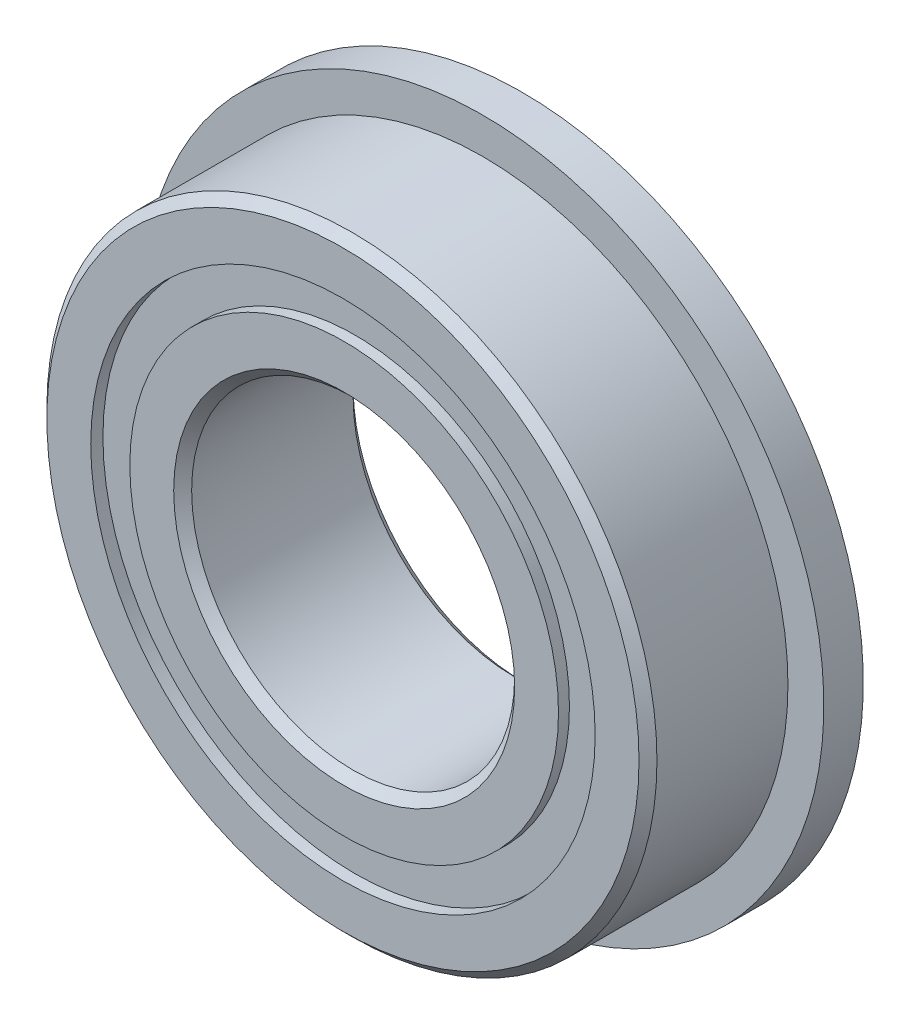
ISO-10303-21;
HEADER;
FILE_DESCRIPTION(('STEP AP214'),'2;1');
FILE_NAME('part.step','',(''),(''),'','','');
FILE_SCHEMA(('AUTOMOTIVE_DESIGN { 1 0 10303 214 1 1 1 1 }'));
ENDSEC;
DATA;
#1=APPLICATION_CONTEXT('core data for automotive mechanical design processes');
#2=APPLICATION_PROTOCOL_DEFINITION('international standard','automotive_design',2000,#1);
#3=PRODUCT_CONTEXT('',#1,'mechanical');
#4=PRODUCT('Part','Part','',(#3));
#5=PRODUCT_RELATED_PRODUCT_CATEGORY('part','',(#4));
#6=PRODUCT_DEFINITION_FORMATION('','',#4);
#7=PRODUCT_DEFINITION_CONTEXT('part definition',#1,'design');
#8=PRODUCT_DEFINITION('design','',#6,#7);
#9=PRODUCT_DEFINITION_SHAPE('','',#8);
#10=(LENGTH_UNIT() NAMED_UNIT(*) SI_UNIT(.MILLI.,.METRE.));
#11=(NAMED_UNIT(*) PLANE_ANGLE_UNIT() SI_UNIT($,.RADIAN.));
#12=(NAMED_UNIT(*) SI_UNIT($,.STERADIAN.) SOLID_ANGLE_UNIT());
#13=UNCERTAINTY_MEASURE_WITH_UNIT(LENGTH_MEASURE(1.E-05),#10,'distance_accuracy_value','');
#14=(GEOMETRIC_REPRESENTATION_CONTEXT(3) GLOBAL_UNCERTAINTY_ASSIGNED_CONTEXT((#13)) GLOBAL_UNIT_ASSIGNED_CONTEXT((#10,
#11,#12)) REPRESENTATION_CONTEXT('',''));
#15=CARTESIAN_POINT('',(0.,0.,0.));
#16=DIRECTION('',(0.,0.,1.));
#17=DIRECTION('',(1.,0.,0.));
#18=AXIS2_PLACEMENT_3D('',#15,#16,#17);
#19=CARTESIAN_POINT('',(0.,0.,2.53780535874026));
#20=DIRECTION('',(0.,0.,-1.));
#21=DIRECTION('',(-1.,0.,0.));
#22=AXIS2_PLACEMENT_3D('',#19,#20,#21);
#23=CONICAL_SURFACE('',#22,9.44444444444445,0.785398163397447);
#24=CARTESIAN_POINT('',(0.,0.,2.81558313651804));
#25=DIRECTION('',(0.,0.,1.));
#26=DIRECTION('',(1.,0.,0.));
#27=AXIS2_PLACEMENT_3D('',#24,#25,#26);
#28=CIRCLE('',#27,9.16666666666667);
#29=CARTESIAN_POINT('',(9.16666666666667,0.,2.81558313651804));
#30=VERTEX_POINT('',#29);
#31=EDGE_CURVE('E76',#30,#30,#28,.T.);
#32=ORIENTED_EDGE('',*,*,#31,.F.);
#33=EDGE_LOOP('',(#32));
#34=FACE_BOUND('',#33,.T.);
#35=CARTESIAN_POINT('',(0.,0.,2.53780535874026));
#36=DIRECTION('',(0.,0.,1.));
#37=DIRECTION('',(1.,0.,0.));
#38=AXIS2_PLACEMENT_3D('',#35,#36,#37);
#39=CIRCLE('',#38,9.44444444444445);
#40=CARTESIAN_POINT('',(9.44444444444445,0.,2.53780535874026));
#41=VERTEX_POINT('',#40);
#42=EDGE_CURVE('E11',#41,#41,#39,.T.);
#43=ORIENTED_EDGE('',*,*,#42,.T.);
#44=EDGE_LOOP('',(#43));
#45=FACE_BOUND('',#44,.T.);
#46=ADVANCED_FACE('F47',(#34,#45),#23,.T.);
#47=CARTESIAN_POINT('',(0.,0.,2.81558313651804));
#48=DIRECTION('',(0.,0.,1.));
#49=DIRECTION('',(1.,0.,0.));
#50=AXIS2_PLACEMENT_3D('',#47,#48,#49);
#51=CYLINDRICAL_SURFACE('',#50,9.44444444444445);
#52=CARTESIAN_POINT('',(0.,0.,-1.5177501968153));
#53=DIRECTION('',(0.,0.,1.));
#54=DIRECTION('',(1.,0.,0.));
#55=AXIS2_PLACEMENT_3D('',#52,#53,#54);
#56=CIRCLE('',#55,9.44444444444445);
#57=CARTESIAN_POINT('',(9.44444444444445,0.,-1.5177501968153));
#58=VERTEX_POINT('',#57);
#59=EDGE_CURVE('E79',#58,#58,#56,.T.);
#60=ORIENTED_EDGE('',*,*,#59,.T.);
#61=EDGE_LOOP('',(#60));
#62=FACE_BOUND('',#61,.T.);
#63=ORIENTED_EDGE('',*,*,#42,.F.);
#64=EDGE_LOOP('',(#63));
#65=FACE_BOUND('',#64,.T.);
#66=ADVANCED_FACE('F101',(#62,#65),#51,.T.);
#67=CARTESIAN_POINT('',(0.,9.16666666666667,-2.73997241903752));
#68=DIRECTION('',(0.,0.,1.));
#69=DIRECTION('',(1.,0.,0.));
#70=AXIS2_PLACEMENT_3D('',#67,#68,#69);
#71=PLANE('',#70);
#72=CARTESIAN_POINT('',(0.,0.,-2.73997241903752));
#73=DIRECTION('',(0.,0.,1.));
#74=DIRECTION('',(1.,0.,0.));
#75=AXIS2_PLACEMENT_3D('',#72,#73,#74);
#76=CIRCLE('',#75,7.80830280830281);
#77=CARTESIAN_POINT('',(7.80830280830281,0.,-2.73997241903752));
#78=VERTEX_POINT('',#77);
#79=EDGE_CURVE('E54',#78,#78,#76,.T.);
#80=ORIENTED_EDGE('',*,*,#79,.T.);
#81=EDGE_LOOP('',(#80));
#82=FACE_BOUND('',#81,.T.);
#83=CARTESIAN_POINT('',(0.,0.,-2.73997241903752));
#84=DIRECTION('',(0.,0.,-1.));
#85=DIRECTION('',(-1.,0.,0.));
#86=AXIS2_PLACEMENT_3D('',#83,#84,#85);
#87=CIRCLE('',#86,10.5555555555556);
#88=CARTESIAN_POINT('',(-10.5555555555556,0.,-2.73997241903752));
#89=VERTEX_POINT('',#88);
#90=EDGE_CURVE('E82',#89,#89,#87,.T.);
#91=ORIENTED_EDGE('',*,*,#90,.T.);
#92=EDGE_LOOP('',(#91));
#93=FACE_BOUND('',#92,.T.);
#94=ADVANCED_FACE('F104',(#82,#93),#71,.F.);
#95=CARTESIAN_POINT('',(0.,0.,2.81558313651804));
#96=DIRECTION('',(0.,0.,1.));
#97=DIRECTION('',(1.,0.,0.));
#98=AXIS2_PLACEMENT_3D('',#95,#96,#97);
#99=CYLINDRICAL_SURFACE('',#98,7.80830280830281);
#100=CARTESIAN_POINT('',(0.,0.,-1.19676254249431));
#101=DIRECTION('',(0.,0.,1.));
#102=DIRECTION('',(1.,0.,0.));
#103=AXIS2_PLACEMENT_3D('',#100,#101,#102);
#104=CIRCLE('',#103,7.80830280830281);
#105=CARTESIAN_POINT('',(7.80830280830281,0.,-1.19676254249431));
#106=VERTEX_POINT('',#105);
#107=EDGE_CURVE('E60',#106,#106,#104,.T.);
#108=ORIENTED_EDGE('',*,*,#107,.T.);
#109=EDGE_LOOP('',(#108));
#110=FACE_BOUND('',#109,.T.);
#111=ORIENTED_EDGE('',*,*,#79,.F.);
#112=EDGE_LOOP('',(#111));
#113=FACE_BOUND('',#112,.T.);
#114=ADVANCED_FACE('F109',(#110,#113),#99,.F.);
#115=CARTESIAN_POINT('',(0.,0.,0.0378053587402572));
#116=DIRECTION('',(0.,0.,1.));
#117=DIRECTION('',(1.,0.,0.));
#118=AXIS2_PLACEMENT_3D('',#115,#116,#117);
#119=TOROIDAL_SURFACE('',#118,7.22222222222222,1.36661931646647);
#120=ORIENTED_EDGE('',*,*,#107,.F.);
#121=EDGE_LOOP('',(#120));
#122=FACE_BOUND('',#121,.T.);
#123=CARTESIAN_POINT('',(0.,0.,1.27237325997483));
#124=DIRECTION('',(0.,0.,1.));
#125=DIRECTION('',(1.,0.,0.));
#126=AXIS2_PLACEMENT_3D('',#123,#124,#125);
#127=CIRCLE('',#126,7.80830280830281);
#128=CARTESIAN_POINT('',(7.80830280830281,0.,1.27237325997483));
#129=VERTEX_POINT('',#128);
#130=EDGE_CURVE('E66',#129,#129,#127,.T.);
#131=ORIENTED_EDGE('',*,*,#130,.T.);
#132=EDGE_LOOP('',(#131));
#133=FACE_BOUND('',#132,.T.);
#134=ADVANCED_FACE('F115',(#122,#133),#119,.F.);
#135=CARTESIAN_POINT('',(0.,0.,2.81558313651804));
#136=DIRECTION('',(0.,0.,1.));
#137=DIRECTION('',(1.,0.,0.));
#138=AXIS2_PLACEMENT_3D('',#135,#136,#137);
#139=CYLINDRICAL_SURFACE('',#138,7.80830280830281);
#140=ORIENTED_EDGE('',*,*,#130,.F.);
#141=EDGE_LOOP('',(#140));
#142=FACE_BOUND('',#141,.T.);
#143=CARTESIAN_POINT('',(0.,0.,2.81558313651804));
#144=DIRECTION('',(0.,0.,1.));
#145=DIRECTION('',(1.,0.,0.));
#146=AXIS2_PLACEMENT_3D('',#143,#144,#145);
#147=CIRCLE('',#146,7.80830280830281);
#148=CARTESIAN_POINT('',(7.80830280830281,0.,2.81558313651804));
#149=VERTEX_POINT('',#148);
#150=EDGE_CURVE('E72',#149,#149,#147,.T.);
#151=ORIENTED_EDGE('',*,*,#150,.T.);
#152=EDGE_LOOP('',(#151));
#153=FACE_BOUND('',#152,.T.);
#154=ADVANCED_FACE('F119',(#142,#153),#139,.F.);
#155=CARTESIAN_POINT('',(0.,9.16666666666667,2.81558313651804));
#156=DIRECTION('',(0.,0.,-1.));
#157=DIRECTION('',(-1.,0.,0.));
#158=AXIS2_PLACEMENT_3D('',#155,#156,#157);
#159=PLANE('',#158);
#160=ORIENTED_EDGE('',*,*,#150,.F.);
#161=EDGE_LOOP('',(#160));
#162=FACE_BOUND('',#161,.T.);
#163=ORIENTED_EDGE('',*,*,#31,.T.);
#164=EDGE_LOOP('',(#163));
#165=FACE_BOUND('',#164,.T.);
#166=ADVANCED_FACE('F97',(#162,#165),#159,.F.);
#167=CARTESIAN_POINT('',(0.,7.80830280830281,-1.5177501968153));
#168=DIRECTION('',(0.,0.,1.));
#169=DIRECTION('',(1.,0.,0.));
#170=AXIS2_PLACEMENT_3D('',#167,#168,#169);
#171=PLANE('',#170);
#172=CARTESIAN_POINT('',(0.,0.,-1.5177501968153));
#173=DIRECTION('',(0.,0.,-1.));
#174=DIRECTION('',(-1.,0.,0.));
#175=AXIS2_PLACEMENT_3D('',#172,#173,#174);
#176=CIRCLE('',#175,10.5555555555556);
#177=CARTESIAN_POINT('',(-10.5555555555556,0.,-1.5177501968153));
#178=VERTEX_POINT('',#177);
#179=EDGE_CURVE('E86',#178,#178,#176,.T.);
#180=ORIENTED_EDGE('',*,*,#179,.F.);
#181=EDGE_LOOP('',(#180));
#182=FACE_BOUND('',#181,.T.);
#183=ORIENTED_EDGE('',*,*,#59,.F.);
#184=EDGE_LOOP('',(#183));
#185=FACE_BOUND('',#184,.T.);
#186=ADVANCED_FACE('F94',(#182,#185),#171,.T.);
#187=CARTESIAN_POINT('',(0.,0.,-2.73997241903752));
#188=DIRECTION('',(0.,0.,-1.));
#189=DIRECTION('',(-1.,0.,0.));
#190=AXIS2_PLACEMENT_3D('',#187,#188,#189);
#191=CYLINDRICAL_SURFACE('',#190,10.5555555555556);
#192=ORIENTED_EDGE('',*,*,#179,.T.);
#193=EDGE_LOOP('',(#192));
#194=FACE_BOUND('',#193,.T.);
#195=ORIENTED_EDGE('',*,*,#90,.F.);
#196=EDGE_LOOP('',(#195));
#197=FACE_BOUND('',#196,.T.);
#198=ADVANCED_FACE('F91',(#194,#197),#191,.T.);
#199=CLOSED_SHELL('',(#46,#66,#94,#114,#134,#154,#166,#186,#198));
#200=MANIFOLD_SOLID_BREP('B2',#199);
#201=CARTESIAN_POINT('',(0.,6.63614163614164,2.77777777777778));
#202=DIRECTION('',(0.,0.,-1.));
#203=DIRECTION('',(-1.,0.,0.));
#204=AXIS2_PLACEMENT_3D('',#201,#202,#203);
#205=PLANE('',#204);
#206=CARTESIAN_POINT('',(0.,0.,2.77777777777778));
#207=DIRECTION('',(0.,0.,1.));
#208=DIRECTION('',(1.,0.,0.));
#209=AXIS2_PLACEMENT_3D('',#206,#207,#208);
#210=CIRCLE('',#209,5.27777777777778);
#211=CARTESIAN_POINT('',(5.27777777777778,0.,2.77777777777778));
#212=VERTEX_POINT('',#211);
#213=EDGE_CURVE('E247',#212,#212,#210,.T.);
#214=ORIENTED_EDGE('',*,*,#213,.F.);
#215=EDGE_LOOP('',(#214));
#216=FACE_BOUND('',#215,.T.);
#217=CARTESIAN_POINT('',(0.,0.,2.77777777777778));
#218=DIRECTION('',(0.,0.,1.));
#219=DIRECTION('',(1.,0.,0.));
#220=AXIS2_PLACEMENT_3D('',#217,#218,#219);
#221=CIRCLE('',#220,6.63614163614164);
#222=CARTESIAN_POINT('',(6.63614163614164,0.,2.77777777777778));
#223=VERTEX_POINT('',#222);
#224=EDGE_CURVE('E46',#223,#223,#221,.T.);
#225=ORIENTED_EDGE('',*,*,#224,.T.);
#226=EDGE_LOOP('',(#225));
#227=FACE_BOUND('',#226,.T.);
#228=ADVANCED_FACE('F211',(#216,#227),#205,.F.);
#229=CARTESIAN_POINT('',(0.,0.,2.77777777777778));
#230=DIRECTION('',(0.,0.,1.));
#231=DIRECTION('',(1.,0.,0.));
#232=AXIS2_PLACEMENT_3D('',#229,#230,#231);
#233=CYLINDRICAL_SURFACE('',#232,6.63614163614164);
#234=ORIENTED_EDGE('',*,*,#224,.F.);
#235=EDGE_LOOP('',(#234));
#236=FACE_BOUND('',#235,.T.);
#237=CARTESIAN_POINT('',(0.,0.,1.23456790123457));
#238=DIRECTION('',(0.,0.,1.));
#239=DIRECTION('',(1.,0.,0.));
#240=AXIS2_PLACEMENT_3D('',#237,#238,#239);
#241=CIRCLE('',#240,6.63614163614164);
#242=CARTESIAN_POINT('',(6.63614163614164,0.,1.23456790123457));
#243=VERTEX_POINT('',#242);
#244=EDGE_CURVE('E218',#243,#243,#241,.T.);
#245=ORIENTED_EDGE('',*,*,#244,.T.);
#246=EDGE_LOOP('',(#245));
#247=FACE_BOUND('',#246,.T.);
#248=ADVANCED_FACE('F254',(#236,#247),#233,.T.);
#249=CARTESIAN_POINT('',(0.,0.,0.));
#250=DIRECTION('',(0.,0.,1.));
#251=DIRECTION('',(1.,0.,0.));
#252=AXIS2_PLACEMENT_3D('',#249,#250,#251);
#253=TOROIDAL_SURFACE('',#252,7.22222222222222,1.36661931646647);
#254=ORIENTED_EDGE('',*,*,#244,.F.);
#255=EDGE_LOOP('',(#254));
#256=FACE_BOUND('',#255,.T.);
#257=CARTESIAN_POINT('',(0.,0.,-1.23456790123457));
#258=DIRECTION('',(0.,0.,1.));
#259=DIRECTION('',(1.,0.,0.));
#260=AXIS2_PLACEMENT_3D('',#257,#258,#259);
#261=CIRCLE('',#260,6.63614163614164);
#262=CARTESIAN_POINT('',(6.63614163614164,0.,-1.23456790123457));
#263=VERTEX_POINT('',#262);
#264=EDGE_CURVE('E225',#263,#263,#261,.T.);
#265=ORIENTED_EDGE('',*,*,#264,.T.);
#266=EDGE_LOOP('',(#265));
#267=FACE_BOUND('',#266,.T.);
#268=ADVANCED_FACE('F258',(#256,#267),#253,.F.);
#269=CARTESIAN_POINT('',(0.,0.,2.77777777777778));
#270=DIRECTION('',(0.,0.,1.));
#271=DIRECTION('',(1.,0.,0.));
#272=AXIS2_PLACEMENT_3D('',#269,#270,#271);
#273=CYLINDRICAL_SURFACE('',#272,6.63614163614164);
#274=ORIENTED_EDGE('',*,*,#264,.F.);
#275=EDGE_LOOP('',(#274));
#276=FACE_BOUND('',#275,.T.);
#277=CARTESIAN_POINT('',(0.,0.,-2.77777777777778));
#278=DIRECTION('',(0.,0.,1.));
#279=DIRECTION('',(1.,0.,0.));
#280=AXIS2_PLACEMENT_3D('',#277,#278,#279);
#281=CIRCLE('',#280,6.63614163614164);
#282=CARTESIAN_POINT('',(6.63614163614164,0.,-2.77777777777778));
#283=VERTEX_POINT('',#282);
#284=EDGE_CURVE('E230',#283,#283,#281,.T.);
#285=ORIENTED_EDGE('',*,*,#284,.T.);
#286=EDGE_LOOP('',(#285));
#287=FACE_BOUND('',#286,.T.);
#288=ADVANCED_FACE('F263',(#276,#287),#273,.T.);
#289=CARTESIAN_POINT('',(0.,5.27777777777778,-2.77777777777778));
#290=DIRECTION('',(0.,0.,1.));
#291=DIRECTION('',(1.,0.,0.));
#292=AXIS2_PLACEMENT_3D('',#289,#290,#291);
#293=PLANE('',#292);
#294=ORIENTED_EDGE('',*,*,#284,.F.);
#295=EDGE_LOOP('',(#294));
#296=FACE_BOUND('',#295,.T.);
#297=CARTESIAN_POINT('',(0.,0.,-2.77777777777778));
#298=DIRECTION('',(0.,0.,1.));
#299=DIRECTION('',(1.,0.,0.));
#300=AXIS2_PLACEMENT_3D('',#297,#298,#299);
#301=CIRCLE('',#300,5.27777777777778);
#302=CARTESIAN_POINT('',(5.27777777777778,0.,-2.77777777777778));
#303=VERTEX_POINT('',#302);
#304=EDGE_CURVE('E236',#303,#303,#301,.T.);
#305=ORIENTED_EDGE('',*,*,#304,.T.);
#306=EDGE_LOOP('',(#305));
#307=FACE_BOUND('',#306,.T.);
#308=ADVANCED_FACE('F269',(#296,#307),#293,.F.);
#309=CARTESIAN_POINT('',(0.,0.,-2.5));
#310=DIRECTION('',(0.,0.,-1.));
#311=DIRECTION('',(-1.,0.,0.));
#312=AXIS2_PLACEMENT_3D('',#309,#310,#311);
#313=CONICAL_SURFACE('',#312,5.,0.785398163397445);
#314=ORIENTED_EDGE('',*,*,#304,.F.);
#315=EDGE_LOOP('',(#314));
#316=FACE_BOUND('',#315,.T.);
#317=CARTESIAN_POINT('',(0.,0.,-2.5));
#318=DIRECTION('',(0.,0.,1.));
#319=DIRECTION('',(1.,0.,0.));
#320=AXIS2_PLACEMENT_3D('',#317,#318,#319);
#321=CIRCLE('',#320,5.);
#322=CARTESIAN_POINT('',(5.,0.,-2.5));
#323=VERTEX_POINT('',#322);
#324=EDGE_CURVE('E240',#323,#323,#321,.T.);
#325=ORIENTED_EDGE('',*,*,#324,.T.);
#326=EDGE_LOOP('',(#325));
#327=FACE_BOUND('',#326,.T.);
#328=ADVANCED_FACE('F273',(#316,#327),#313,.F.);
#329=CARTESIAN_POINT('',(0.,0.,2.77777777777778));
#330=DIRECTION('',(0.,0.,1.));
#331=DIRECTION('',(1.,0.,0.));
#332=AXIS2_PLACEMENT_3D('',#329,#330,#331);
#333=CYLINDRICAL_SURFACE('',#332,5.);
#334=ORIENTED_EDGE('',*,*,#324,.F.);
#335=EDGE_LOOP('',(#334));
#336=FACE_BOUND('',#335,.T.);
#337=CARTESIAN_POINT('',(0.,0.,2.5));
#338=DIRECTION('',(0.,0.,1.));
#339=DIRECTION('',(1.,0.,0.));
#340=AXIS2_PLACEMENT_3D('',#337,#338,#339);
#341=CIRCLE('',#340,5.);
#342=CARTESIAN_POINT('',(5.,0.,2.5));
#343=VERTEX_POINT('',#342);
#344=EDGE_CURVE('E243',#343,#343,#341,.T.);
#345=ORIENTED_EDGE('',*,*,#344,.T.);
#346=EDGE_LOOP('',(#345));
#347=FACE_BOUND('',#346,.T.);
#348=ADVANCED_FACE('F277',(#336,#347),#333,.F.);
#349=CARTESIAN_POINT('',(0.,0.,2.77777777777778));
#350=DIRECTION('',(0.,0.,1.));
#351=DIRECTION('',(1.,0.,0.));
#352=AXIS2_PLACEMENT_3D('',#349,#350,#351);
#353=CONICAL_SURFACE('',#352,5.27777777777778,0.78539816339745);
#354=ORIENTED_EDGE('',*,*,#344,.F.);
#355=EDGE_LOOP('',(#354));
#356=FACE_BOUND('',#355,.T.);
#357=ORIENTED_EDGE('',*,*,#213,.T.);
#358=EDGE_LOOP('',(#357));
#359=FACE_BOUND('',#358,.T.);
#360=ADVANCED_FACE('F251',(#356,#359),#353,.F.);
#361=CLOSED_SHELL('',(#228,#248,#268,#288,#308,#328,#348,#360));
#362=MANIFOLD_SOLID_BREP('B6',#361);
#363=CARTESIAN_POINT('',(0.,7.80830280830281,2.43861347862112));
#364=DIRECTION('',(0.,0.,-1.));
#365=DIRECTION('',(-1.,0.,0.));
#366=AXIS2_PLACEMENT_3D('',#363,#364,#365);
#367=PLANE('',#366);
#368=CARTESIAN_POINT('',(0.,0.,2.43861347862112));
#369=DIRECTION('',(0.,0.,1.));
#370=DIRECTION('',(1.,0.,0.));
#371=AXIS2_PLACEMENT_3D('',#368,#369,#370);
#372=CIRCLE('',#371,6.63614163614164);
#373=CARTESIAN_POINT('',(6.63614163614164,0.,2.43861347862112));
#374=VERTEX_POINT('',#373);
#375=EDGE_CURVE('E210',#374,#374,#372,.T.);
#376=ORIENTED_EDGE('',*,*,#375,.F.);
#377=EDGE_LOOP('',(#376));
#378=FACE_BOUND('',#377,.T.);
#379=CARTESIAN_POINT('',(0.,0.,2.43861347862112));
#380=DIRECTION('',(0.,0.,1.));
#381=DIRECTION('',(1.,0.,0.));
#382=AXIS2_PLACEMENT_3D('',#379,#380,#381);
#383=CIRCLE('',#382,7.80830280830281);
#384=CARTESIAN_POINT('',(7.80830280830281,0.,2.43861347862112));
#385=VERTEX_POINT('',#384);
#386=EDGE_CURVE('E372',#385,#385,#383,.T.);
#387=ORIENTED_EDGE('',*,*,#386,.T.);
#388=EDGE_LOOP('',(#387));
#389=FACE_BOUND('',#388,.T.);
#390=ADVANCED_FACE('F355',(#378,#389),#367,.F.);
#391=CARTESIAN_POINT('',(0.,0.,2.57750236751001));
#392=DIRECTION('',(0.,0.,1.));
#393=DIRECTION('',(1.,0.,0.));
#394=AXIS2_PLACEMENT_3D('',#391,#392,#393);
#395=CYLINDRICAL_SURFACE('',#394,6.63614163614164);
#396=CARTESIAN_POINT('',(0.,0.,1.1663439061987));
#397=DIRECTION('',(0.,0.,1.));
#398=DIRECTION('',(1.,0.,0.));
#399=AXIS2_PLACEMENT_3D('',#396,#397,#398);
#400=CIRCLE('',#399,6.63614163614164);
#401=CARTESIAN_POINT('',(6.63614163614164,0.,1.1663439061987));
#402=VERTEX_POINT('',#401);
#403=EDGE_CURVE('E362',#402,#402,#400,.T.);
#404=ORIENTED_EDGE('',*,*,#403,.F.);
#405=EDGE_LOOP('',(#404));
#406=FACE_BOUND('',#405,.T.);
#407=ORIENTED_EDGE('',*,*,#375,.T.);
#408=EDGE_LOOP('',(#407));
#409=FACE_BOUND('',#408,.T.);
#410=ADVANCED_FACE('F388',(#406,#409),#395,.F.);
#411=CARTESIAN_POINT('',(0.,7.80830280830281,1.1663439061987));
#412=DIRECTION('',(0.,0.,1.));
#413=DIRECTION('',(1.,0.,0.));
#414=AXIS2_PLACEMENT_3D('',#411,#412,#413);
#415=PLANE('',#414);
#416=CARTESIAN_POINT('',(0.,0.,1.1663439061987));
#417=DIRECTION('',(0.,0.,1.));
#418=DIRECTION('',(1.,0.,0.));
#419=AXIS2_PLACEMENT_3D('',#416,#417,#418);
#420=CIRCLE('',#419,7.80830280830281);
#421=CARTESIAN_POINT('',(7.80830280830281,0.,1.1663439061987));
#422=VERTEX_POINT('',#421);
#423=EDGE_CURVE('E368',#422,#422,#420,.T.);
#424=ORIENTED_EDGE('',*,*,#423,.F.);
#425=EDGE_LOOP('',(#424));
#426=FACE_BOUND('',#425,.T.);
#427=ORIENTED_EDGE('',*,*,#403,.T.);
#428=EDGE_LOOP('',(#427));
#429=FACE_BOUND('',#428,.T.);
#430=ADVANCED_FACE('F383',(#426,#429),#415,.F.);
#431=CARTESIAN_POINT('',(0.,0.,2.57750236751001));
#432=DIRECTION('',(0.,0.,1.));
#433=DIRECTION('',(1.,0.,0.));
#434=AXIS2_PLACEMENT_3D('',#431,#432,#433);
#435=CYLINDRICAL_SURFACE('',#434,7.80830280830281);
#436=ORIENTED_EDGE('',*,*,#386,.F.);
#437=EDGE_LOOP('',(#436));
#438=FACE_BOUND('',#437,.T.);
#439=ORIENTED_EDGE('',*,*,#423,.T.);
#440=EDGE_LOOP('',(#439));
#441=FACE_BOUND('',#440,.T.);
#442=ADVANCED_FACE('F380',(#438,#441),#435,.T.);
#443=CLOSED_SHELL('',(#390,#410,#430,#442));
#444=MANIFOLD_SOLID_BREP('B41',#443);
#445=CARTESIAN_POINT('',(0.,7.80830280830281,-2.43861347862112));
#446=DIRECTION('',(0.,0.,1.));
#447=DIRECTION('',(1.,0.,0.));
#448=AXIS2_PLACEMENT_3D('',#445,#446,#447);
#449=PLANE('',#448);
#450=CARTESIAN_POINT('',(0.,0.,-2.43861347862112));
#451=DIRECTION('',(0.,0.,1.));
#452=DIRECTION('',(1.,0.,0.));
#453=AXIS2_PLACEMENT_3D('',#450,#451,#452);
#454=CIRCLE('',#453,7.80830280830281);
#455=CARTESIAN_POINT('',(7.80830280830281,0.,-2.43861347862112));
#456=VERTEX_POINT('',#455);
#457=EDGE_CURVE('E448',#456,#456,#454,.T.);
#458=ORIENTED_EDGE('',*,*,#457,.F.);
#459=EDGE_LOOP('',(#458));
#460=FACE_BOUND('',#459,.T.);
#461=CARTESIAN_POINT('',(0.,0.,-2.43861347862112));
#462=DIRECTION('',(0.,0.,1.));
#463=DIRECTION('',(1.,0.,0.));
#464=AXIS2_PLACEMENT_3D('',#461,#462,#463);
#465=CIRCLE('',#464,6.63614163614164);
#466=CARTESIAN_POINT('',(6.63614163614164,0.,-2.43861347862112));
#467=VERTEX_POINT('',#466);
#468=EDGE_CURVE('E354',#467,#467,#465,.T.);
#469=ORIENTED_EDGE('',*,*,#468,.T.);
#470=EDGE_LOOP('',(#469));
#471=FACE_BOUND('',#470,.T.);
#472=ADVANCED_FACE('F430',(#460,#471),#449,.F.);
#473=CARTESIAN_POINT('',(0.,0.,2.97805318804555));
#474=DIRECTION('',(0.,0.,1.));
#475=DIRECTION('',(1.,0.,0.));
#476=AXIS2_PLACEMENT_3D('',#473,#474,#475);
#477=CYLINDRICAL_SURFACE('',#476,6.63614163614164);
#478=ORIENTED_EDGE('',*,*,#468,.F.);
#479=EDGE_LOOP('',(#478));
#480=FACE_BOUND('',#479,.T.);
#481=CARTESIAN_POINT('',(0.,0.,-1.1663439061987));
#482=DIRECTION('',(0.,0.,1.));
#483=DIRECTION('',(1.,0.,0.));
#484=AXIS2_PLACEMENT_3D('',#481,#482,#483);
#485=CIRCLE('',#484,6.63614163614164);
#486=CARTESIAN_POINT('',(6.63614163614164,0.,-1.1663439061987));
#487=VERTEX_POINT('',#486);
#488=EDGE_CURVE('E437',#487,#487,#485,.T.);
#489=ORIENTED_EDGE('',*,*,#488,.T.);
#490=EDGE_LOOP('',(#489));
#491=FACE_BOUND('',#490,.T.);
#492=ADVANCED_FACE('F457',(#480,#491),#477,.F.);
#493=CARTESIAN_POINT('',(0.,7.80830280830281,-1.1663439061987));
#494=DIRECTION('',(0.,0.,-1.));
#495=DIRECTION('',(-1.,0.,0.));
#496=AXIS2_PLACEMENT_3D('',#493,#494,#495);
#497=PLANE('',#496);
#498=ORIENTED_EDGE('',*,*,#488,.F.);
#499=EDGE_LOOP('',(#498));
#500=FACE_BOUND('',#499,.T.);
#501=CARTESIAN_POINT('',(0.,0.,-1.1663439061987));
#502=DIRECTION('',(0.,0.,1.));
#503=DIRECTION('',(1.,0.,0.));
#504=AXIS2_PLACEMENT_3D('',#501,#502,#503);
#505=CIRCLE('',#504,7.80830280830281);
#506=CARTESIAN_POINT('',(7.80830280830281,0.,-1.1663439061987));
#507=VERTEX_POINT('',#506);
#508=EDGE_CURVE('E442',#507,#507,#505,.T.);
#509=ORIENTED_EDGE('',*,*,#508,.T.);
#510=EDGE_LOOP('',(#509));
#511=FACE_BOUND('',#510,.T.);
#512=ADVANCED_FACE('F461',(#500,#511),#497,.F.);
#513=CARTESIAN_POINT('',(0.,0.,2.97805318804555));
#514=DIRECTION('',(0.,0.,1.));
#515=DIRECTION('',(1.,0.,0.));
#516=AXIS2_PLACEMENT_3D('',#513,#514,#515);
#517=CYLINDRICAL_SURFACE('',#516,7.80830280830281);
#518=ORIENTED_EDGE('',*,*,#508,.F.);
#519=EDGE_LOOP('',(#518));
#520=FACE_BOUND('',#519,.T.);
#521=ORIENTED_EDGE('',*,*,#457,.T.);
#522=EDGE_LOOP('',(#521));
#523=FACE_BOUND('',#522,.T.);
#524=ADVANCED_FACE('F454',(#520,#523),#517,.T.);
#525=CLOSED_SHELL('',(#472,#492,#512,#524));
#526=MANIFOLD_SOLID_BREP('B205',#525);
#527=CARTESIAN_POINT('',(-3.24999999999993,5.62916512459889,0.));
#528=DIRECTION('',(0.,0.,1.));
#529=DIRECTION('',(-0.499999999999989,0.866025403784445,0.));
#530=AXIS2_PLACEMENT_3D('',#527,#528,#529);
#531=SPHERICAL_SURFACE('',#530,1.22995738481983);
#532=CARTESIAN_POINT('',(-3.24999999999993,5.62916512459889,1.22995738481983));
#533=VERTEX_POINT('',#532);
#534=VERTEX_LOOP('',#533);
#535=FACE_BOUND('',#534,.T.);
#536=ADVANCED_FACE('F505',(#535),#531,.T.);
#537=CLOSED_SHELL('',(#536));
#538=MANIFOLD_SOLID_BREP('B349',#537);
#539=CARTESIAN_POINT('',(-5.62916512459881,3.25000000000007,0.));
#540=DIRECTION('',(0.,0.,1.));
#541=DIRECTION('',(-0.866025403784433,0.50000000000001,0.));
#542=AXIS2_PLACEMENT_3D('',#539,#540,#541);
#543=SPHERICAL_SURFACE('',#542,1.22995738481983);
#544=CARTESIAN_POINT('',(-5.62916512459881,3.25000000000007,1.22995738481983));
#545=VERTEX_POINT('',#544);
#546=VERTEX_LOOP('',#545);
#547=FACE_BOUND('',#546,.T.);
#548=ADVANCED_FACE('F525',(#547),#543,.T.);
#549=CLOSED_SHELL('',(#548));
#550=MANIFOLD_SOLID_BREP('B426',#549);
#551=CARTESIAN_POINT('',(-6.5,0.,0.));
#552=DIRECTION('',(0.,0.,1.));
#553=DIRECTION('',(-1.,0.,0.));
#554=AXIS2_PLACEMENT_3D('',#551,#552,#553);
#555=SPHERICAL_SURFACE('',#554,1.22995738481983);
#556=CARTESIAN_POINT('',(-6.5,0.,1.22995738481983));
#557=VERTEX_POINT('',#556);
#558=VERTEX_LOOP('',#557);
#559=FACE_BOUND('',#558,.T.);
#560=ADVANCED_FACE('F545',(#559),#555,.T.);
#561=CLOSED_SHELL('',(#560));
#562=MANIFOLD_SOLID_BREP('B501',#561);
#563=CARTESIAN_POINT('',(-5.62916512459888,-3.24999999999995,0.));
#564=DIRECTION('',(0.,0.,1.));
#565=DIRECTION('',(-0.866025403784443,-0.499999999999992,0.));
#566=AXIS2_PLACEMENT_3D('',#563,#564,#565);
#567=SPHERICAL_SURFACE('',#566,1.22995738481983);
#568=CARTESIAN_POINT('',(-5.62916512459888,-3.24999999999995,1.22995738481983));
#569=VERTEX_POINT('',#568);
#570=VERTEX_LOOP('',#569);
#571=FACE_BOUND('',#570,.T.);
#572=ADVANCED_FACE('F565',(#571),#567,.T.);
#573=CLOSED_SHELL('',(#572));
#574=MANIFOLD_SOLID_BREP('B521',#573);
#575=CARTESIAN_POINT('',(-3.25000000000005,-5.62916512459883,0.));
#576=DIRECTION('',(0.,0.,1.));
#577=DIRECTION('',(-0.500000000000007,-0.866025403784435,0.));
#578=AXIS2_PLACEMENT_3D('',#575,#576,#577);
#579=SPHERICAL_SURFACE('',#578,1.22995738481983);
#580=CARTESIAN_POINT('',(-3.25000000000005,-5.62916512459883,1.22995738481983));
#581=VERTEX_POINT('',#580);
#582=VERTEX_LOOP('',#581);
#583=FACE_BOUND('',#582,.T.);
#584=ADVANCED_FACE('F586',(#583),#579,.T.);
#585=CLOSED_SHELL('',(#584));
#586=MANIFOLD_SOLID_BREP('B541',#585);
#587=CARTESIAN_POINT('',(0.,-6.5,0.));
#588=DIRECTION('',(0.,0.,1.));
#589=DIRECTION('',(0.,-1.,0.));
#590=AXIS2_PLACEMENT_3D('',#587,#588,#589);
#591=SPHERICAL_SURFACE('',#590,1.22995738481983);
#592=CARTESIAN_POINT('',(0.,-6.5,1.22995738481983));
#593=VERTEX_POINT('',#592);
#594=VERTEX_LOOP('',#593);
#595=FACE_BOUND('',#594,.T.);
#596=ADVANCED_FACE('F606',(#595),#591,.T.);
#597=CLOSED_SHELL('',(#596));
#598=MANIFOLD_SOLID_BREP('B561',#597);
#599=CARTESIAN_POINT('',(3.24999999999997,-5.62916512459887,0.));
#600=DIRECTION('',(0.,0.,1.));
#601=DIRECTION('',(0.499999999999995,-0.866025403784442,0.));
#602=AXIS2_PLACEMENT_3D('',#599,#600,#601);
#603=SPHERICAL_SURFACE('',#602,1.22995738481983);
#604=CARTESIAN_POINT('',(3.24999999999997,-5.62916512459887,1.22995738481983));
#605=VERTEX_POINT('',#604);
#606=VERTEX_LOOP('',#605);
#607=FACE_BOUND('',#606,.T.);
#608=ADVANCED_FACE('F627',(#607),#603,.T.);
#609=CLOSED_SHELL('',(#608));
#610=MANIFOLD_SOLID_BREP('B582',#609);
#611=CARTESIAN_POINT('',(5.62916512459884,-3.25000000000003,0.));
#612=DIRECTION('',(0.,0.,1.));
#613=DIRECTION('',(0.866025403784436,-0.500000000000004,0.));
#614=AXIS2_PLACEMENT_3D('',#611,#612,#613);
#615=SPHERICAL_SURFACE('',#614,1.22995738481983);
#616=CARTESIAN_POINT('',(5.62916512459884,-3.25000000000003,1.22995738481983));
#617=VERTEX_POINT('',#616);
#618=VERTEX_LOOP('',#617);
#619=FACE_BOUND('',#618,.T.);
#620=ADVANCED_FACE('F647',(#619),#615,.T.);
#621=CLOSED_SHELL('',(#620));
#622=MANIFOLD_SOLID_BREP('B602',#621);
#623=CARTESIAN_POINT('',(6.5,0.,0.));
#624=DIRECTION('',(0.,0.,1.));
#625=DIRECTION('',(1.,0.,0.));
#626=AXIS2_PLACEMENT_3D('',#623,#624,#625);
#627=SPHERICAL_SURFACE('',#626,1.22995738481983);
#628=CARTESIAN_POINT('',(6.5,0.,1.22995738481983));
#629=VERTEX_POINT('',#628);
#630=VERTEX_LOOP('',#629);
#631=FACE_BOUND('',#630,.T.);
#632=ADVANCED_FACE('F667',(#631),#627,.T.);
#633=CLOSED_SHELL('',(#632));
#634=MANIFOLD_SOLID_BREP('B623',#633);
#635=CARTESIAN_POINT('',(5.62916512459886,3.24999999999999,0.));
#636=DIRECTION('',(0.,0.,1.));
#637=DIRECTION('',(0.86602540378444,0.499999999999998,0.));
#638=AXIS2_PLACEMENT_3D('',#635,#636,#637);
#639=SPHERICAL_SURFACE('',#638,1.22995738481983);
#640=CARTESIAN_POINT('',(5.62916512459886,3.24999999999999,1.22995738481983));
#641=VERTEX_POINT('',#640);
#642=VERTEX_LOOP('',#641);
#643=FACE_BOUND('',#642,.T.);
#644=ADVANCED_FACE('F688',(#643),#639,.T.);
#645=CLOSED_SHELL('',(#644));
#646=MANIFOLD_SOLID_BREP('B643',#645);
#647=CARTESIAN_POINT('',(3.25000000000001,5.62916512459885,0.));
#648=DIRECTION('',(0.,0.,1.));
#649=DIRECTION('',(0.500000000000001,0.866025403784438,0.));
#650=AXIS2_PLACEMENT_3D('',#647,#648,#649);
#651=SPHERICAL_SURFACE('',#650,1.22995738481983);
#652=CARTESIAN_POINT('',(3.25000000000001,5.62916512459885,1.22995738481983));
#653=VERTEX_POINT('',#652);
#654=VERTEX_LOOP('',#653);
#655=FACE_BOUND('',#654,.T.);
#656=ADVANCED_FACE('F707',(#655),#651,.T.);
#657=CLOSED_SHELL('',(#656));
#658=MANIFOLD_SOLID_BREP('B663',#657);
#659=CARTESIAN_POINT('',(0.,6.5,0.));
#660=DIRECTION('',(0.,0.,1.));
#661=DIRECTION('',(0.,1.,0.));
#662=AXIS2_PLACEMENT_3D('',#659,#660,#661);
#663=SPHERICAL_SURFACE('',#662,1.22995738481983);
#664=CARTESIAN_POINT('',(0.,6.5,1.22995738481983));
#665=VERTEX_POINT('',#664);
#666=VERTEX_LOOP('',#665);
#667=FACE_BOUND('',#666,.T.);
#668=ADVANCED_FACE('F721',(#667),#663,.T.);
#669=CLOSED_SHELL('',(#668));
#670=MANIFOLD_SOLID_BREP('B684',#669);
#671=ADVANCED_BREP_SHAPE_REPRESENTATION('',(#18,#200,#362,#444,#526,#538,#550,#562,#574,#586,
#598,#610,#622,#634,#646,#658,#670),#14);
#672=SHAPE_DEFINITION_REPRESENTATION(#9,#671);
ENDSEC;
END-ISO-10303-21;
